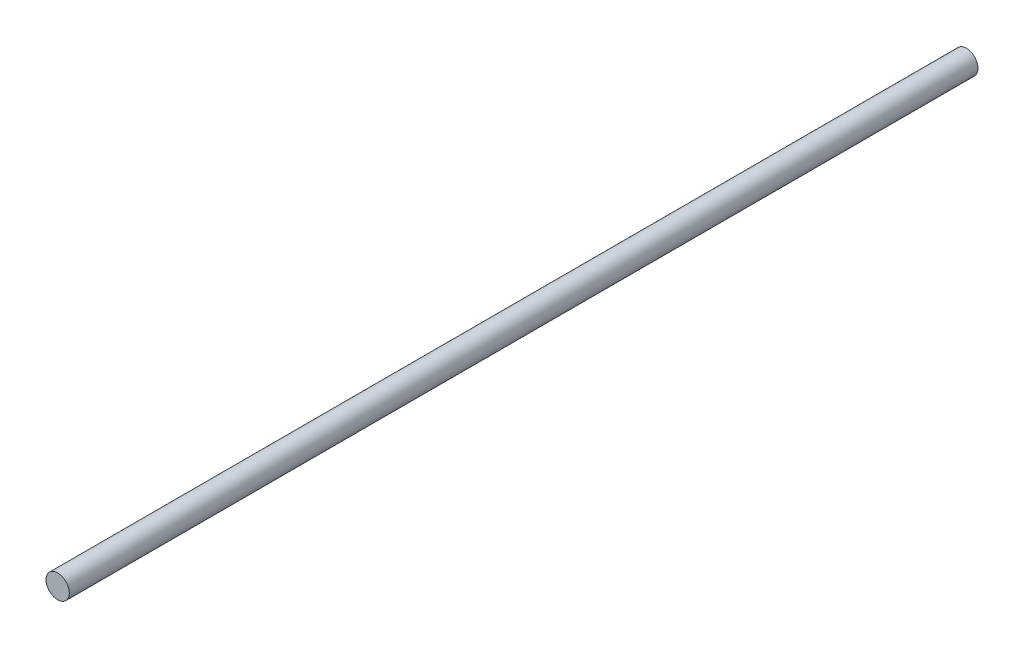
ISO-10303-21;
HEADER;
FILE_DESCRIPTION(('STEP AP214'),'2;1');
FILE_NAME('part.step','',(''),(''),'','','');
FILE_SCHEMA(('AUTOMOTIVE_DESIGN { 1 0 10303 214 1 1 1 1 }'));
ENDSEC;
DATA;
#1=APPLICATION_CONTEXT('core data for automotive mechanical design processes');
#2=APPLICATION_PROTOCOL_DEFINITION('international standard','automotive_design',2000,#1);
#3=PRODUCT_CONTEXT('',#1,'mechanical');
#4=PRODUCT('Part','Part','',(#3));
#5=PRODUCT_RELATED_PRODUCT_CATEGORY('part','',(#4));
#6=PRODUCT_DEFINITION_FORMATION('','',#4);
#7=PRODUCT_DEFINITION_CONTEXT('part definition',#1,'design');
#8=PRODUCT_DEFINITION('design','',#6,#7);
#9=PRODUCT_DEFINITION_SHAPE('','',#8);
#10=(LENGTH_UNIT() NAMED_UNIT(*) SI_UNIT(.MILLI.,.METRE.));
#11=(NAMED_UNIT(*) PLANE_ANGLE_UNIT() SI_UNIT($,.RADIAN.));
#12=(NAMED_UNIT(*) SI_UNIT($,.STERADIAN.) SOLID_ANGLE_UNIT());
#13=UNCERTAINTY_MEASURE_WITH_UNIT(LENGTH_MEASURE(1.E-05),#10,'distance_accuracy_value','');
#14=(GEOMETRIC_REPRESENTATION_CONTEXT(3) GLOBAL_UNCERTAINTY_ASSIGNED_CONTEXT((#13)) GLOBAL_UNIT_ASSIGNED_CONTEXT((#10,
#11,#12)) REPRESENTATION_CONTEXT('',''));
#15=CARTESIAN_POINT('',(0.,0.,0.));
#16=DIRECTION('',(0.,0.,1.));
#17=DIRECTION('',(1.,0.,0.));
#18=AXIS2_PLACEMENT_3D('',#15,#16,#17);
#19=CARTESIAN_POINT('',(0.,0.,468.));
#20=DIRECTION('',(0.,0.,-1.));
#21=DIRECTION('',(-1.,0.,0.));
#22=AXIS2_PLACEMENT_3D('',#19,#20,#21);
#23=CYLINDRICAL_SURFACE('',#22,6.);
#24=CARTESIAN_POINT('',(0.,0.,468.));
#25=DIRECTION('',(0.,0.,1.));
#26=DIRECTION('',(1.,0.,0.));
#27=AXIS2_PLACEMENT_3D('',#24,#25,#26);
#28=CIRCLE('',#27,6.);
#29=CARTESIAN_POINT('',(-6.,0.,468.));
#30=VERTEX_POINT('',#29);
#31=EDGE_CURVE('E10',#30,#30,#28,.T.);
#32=CARTESIAN_POINT('',(0.,0.,0.));
#33=DIRECTION('',(0.,0.,1.));
#34=DIRECTION('',(1.,0.,0.));
#35=AXIS2_PLACEMENT_3D('',#32,#33,#34);
#36=CIRCLE('',#35,6.);
#37=CARTESIAN_POINT('',(-6.,0.,0.));
#38=VERTEX_POINT('',#37);
#39=EDGE_CURVE('E34',#38,#38,#36,.T.);
#40=CARTESIAN_POINT('',(-6.,0.,468.));
#41=CARTESIAN_POINT('',(-6.,0.,463.125));
#42=CARTESIAN_POINT('',(-6.,0.,458.25));
#43=CARTESIAN_POINT('',(-6.,0.,448.5));
#44=CARTESIAN_POINT('',(-6.,0.,443.625));
#45=CARTESIAN_POINT('',(-6.,0.,433.875));
#46=CARTESIAN_POINT('',(-6.,0.,429.));
#47=CARTESIAN_POINT('',(-6.,0.,419.25));
#48=CARTESIAN_POINT('',(-6.,0.,414.375));
#49=CARTESIAN_POINT('',(-6.,0.,404.625));
#50=CARTESIAN_POINT('',(-6.,0.,399.75));
#51=CARTESIAN_POINT('',(-6.,0.,390.));
#52=CARTESIAN_POINT('',(-6.,0.,385.125));
#53=CARTESIAN_POINT('',(-6.,0.,375.375));
#54=CARTESIAN_POINT('',(-6.,0.,370.5));
#55=CARTESIAN_POINT('',(-6.,0.,360.75));
#56=CARTESIAN_POINT('',(-6.,0.,355.875));
#57=CARTESIAN_POINT('',(-6.,0.,346.125));
#58=CARTESIAN_POINT('',(-6.,0.,341.25));
#59=CARTESIAN_POINT('',(-6.,0.,331.5));
#60=CARTESIAN_POINT('',(-6.,0.,326.625));
#61=CARTESIAN_POINT('',(-6.,0.,316.875));
#62=CARTESIAN_POINT('',(-6.,0.,312.));
#63=CARTESIAN_POINT('',(-6.,0.,302.25));
#64=CARTESIAN_POINT('',(-6.,0.,297.375));
#65=CARTESIAN_POINT('',(-6.,0.,287.625));
#66=CARTESIAN_POINT('',(-6.,0.,282.75));
#67=CARTESIAN_POINT('',(-6.,0.,273.));
#68=CARTESIAN_POINT('',(-6.,0.,268.125));
#69=CARTESIAN_POINT('',(-6.,0.,258.375));
#70=CARTESIAN_POINT('',(-6.,0.,253.5));
#71=CARTESIAN_POINT('',(-6.,0.,243.75));
#72=CARTESIAN_POINT('',(-6.,0.,238.875));
#73=CARTESIAN_POINT('',(-6.,0.,229.125));
#74=CARTESIAN_POINT('',(-6.,0.,224.25));
#75=CARTESIAN_POINT('',(-6.,0.,214.5));
#76=CARTESIAN_POINT('',(-6.,0.,209.625));
#77=CARTESIAN_POINT('',(-6.,0.,199.875));
#78=CARTESIAN_POINT('',(-6.,0.,195.));
#79=CARTESIAN_POINT('',(-6.,0.,185.25));
#80=CARTESIAN_POINT('',(-6.,0.,180.375));
#81=CARTESIAN_POINT('',(-6.,0.,170.625));
#82=CARTESIAN_POINT('',(-6.,0.,165.75));
#83=CARTESIAN_POINT('',(-6.,0.,156.));
#84=CARTESIAN_POINT('',(-6.,0.,151.125));
#85=CARTESIAN_POINT('',(-6.,0.,141.375));
#86=CARTESIAN_POINT('',(-6.,0.,136.5));
#87=CARTESIAN_POINT('',(-6.,0.,126.75));
#88=CARTESIAN_POINT('',(-6.,0.,121.875));
#89=CARTESIAN_POINT('',(-6.,0.,112.125));
#90=CARTESIAN_POINT('',(-6.,0.,107.25));
#91=CARTESIAN_POINT('',(-6.,0.,97.4999999999999));
#92=CARTESIAN_POINT('',(-6.,0.,92.6249999999999));
#93=CARTESIAN_POINT('',(-6.,0.,82.8749999999999));
#94=CARTESIAN_POINT('',(-6.,0.,77.9999999999999));
#95=CARTESIAN_POINT('',(-6.,0.,68.2499999999999));
#96=CARTESIAN_POINT('',(-6.,0.,63.3749999999999));
#97=CARTESIAN_POINT('',(-6.,0.,53.6249999999999));
#98=CARTESIAN_POINT('',(-6.,0.,48.7499999999999));
#99=CARTESIAN_POINT('',(-6.,0.,38.9999999999999));
#100=CARTESIAN_POINT('',(-6.,0.,34.1249999999999));
#101=CARTESIAN_POINT('',(-6.,0.,24.3749999999999));
#102=CARTESIAN_POINT('',(-6.,0.,19.4999999999999));
#103=CARTESIAN_POINT('',(-6.,0.,9.74999999999994));
#104=CARTESIAN_POINT('',(-6.,0.,4.87499999999994));
#105=CARTESIAN_POINT('',(-6.,0.,0.));
#106=B_SPLINE_CURVE_WITH_KNOTS('',3,(#40,#41,#42,#43,#44,#45,#46,#47,#48,#49,#50,#51,#52,#53,
#54,#55,#56,#57,#58,#59,#60,#61,#62,#63,#64,#65,#66,#67,#68,#69,#70,#71,#72,#73,#74,#75,#76,#77,
#78,#79,#80,#81,#82,#83,#84,#85,#86,#87,#88,#89,#90,#91,#92,#93,#94,#95,#96,#97,#98,#99,#100,
#101,#102,#103,#104,#105),.UNSPECIFIED.,.F.,.F.,(4,2,2,2,2,2,2,2,2,2,2,2,2,2,2,2,2,2,2,2,2,2,2,
2,2,2,2,2,2,2,2,2,4),(0.,14.6250000000001,29.2500000000001,43.875,58.5,73.125,87.7500000000001,
102.375,117.,131.625,146.25,160.875,175.5,190.125,204.75,219.375,234.,248.625,263.25,277.875,
292.5,307.125,321.75,336.375,351.,365.625,380.25,394.875,409.5,424.125,438.75,453.375,468.),.UNSPECIFIED.);
#107=EDGE_CURVE('BSEAM31',#30,#38,#106,.T.);
#108=ORIENTED_EDGE('',*,*,#31,.F.);
#109=ORIENTED_EDGE('',*,*,#39,.T.);
#110=ORIENTED_EDGE('',*,*,#107,.T.);
#111=ORIENTED_EDGE('',*,*,#107,.F.);
#112=EDGE_LOOP('',(#108,#110,#109,#111));
#113=FACE_BOUND('',#112,.T.);
#114=ADVANCED_FACE('F31',(#113),#23,.T.);
#115=CARTESIAN_POINT('',(0.,0.,468.));
#116=DIRECTION('',(0.,0.,1.));
#117=DIRECTION('',(1.,0.,0.));
#118=AXIS2_PLACEMENT_3D('',#115,#116,#117);
#119=PLANE('',#118);
#120=ORIENTED_EDGE('',*,*,#31,.T.);
#121=EDGE_LOOP('',(#120));
#122=FACE_BOUND('',#121,.T.);
#123=ADVANCED_FACE('F46',(#122),#119,.T.);
#124=CARTESIAN_POINT('',(0.,0.,0.));
#125=DIRECTION('',(0.,0.,1.));
#126=DIRECTION('',(1.,0.,0.));
#127=AXIS2_PLACEMENT_3D('',#124,#125,#126);
#128=PLANE('',#127);
#129=ORIENTED_EDGE('',*,*,#39,.F.);
#130=EDGE_LOOP('',(#129));
#131=FACE_BOUND('',#130,.T.);
#132=ADVANCED_FACE('F44',(#131),#128,.F.);
#133=CLOSED_SHELL('',(#114,#123,#132));
#134=MANIFOLD_SOLID_BREP('B2',#133);
#135=ADVANCED_BREP_SHAPE_REPRESENTATION('',(#18,#134),#14);
#136=SHAPE_DEFINITION_REPRESENTATION(#9,#135);
ENDSEC;
END-ISO-10303-21;
